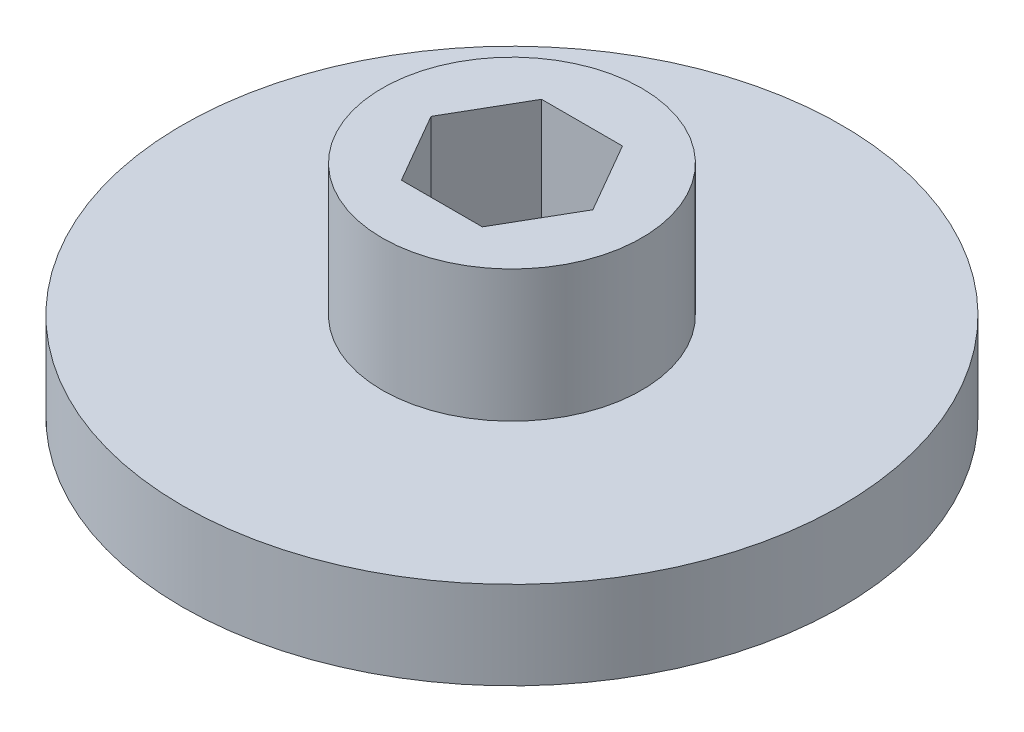
ISO-10303-21;
HEADER;
FILE_DESCRIPTION(('STEP AP214'),'2;1');
FILE_NAME('part.step','',(''),(''),'','','');
FILE_SCHEMA(('AUTOMOTIVE_DESIGN { 1 0 10303 214 1 1 1 1 }'));
ENDSEC;
DATA;
#1=APPLICATION_CONTEXT('core data for automotive mechanical design processes');
#2=APPLICATION_PROTOCOL_DEFINITION('international standard','automotive_design',2000,#1);
#3=PRODUCT_CONTEXT('',#1,'mechanical');
#4=PRODUCT('Part','Part','',(#3));
#5=PRODUCT_RELATED_PRODUCT_CATEGORY('part','',(#4));
#6=PRODUCT_DEFINITION_FORMATION('','',#4);
#7=PRODUCT_DEFINITION_CONTEXT('part definition',#1,'design');
#8=PRODUCT_DEFINITION('design','',#6,#7);
#9=PRODUCT_DEFINITION_SHAPE('','',#8);
#10=(LENGTH_UNIT() NAMED_UNIT(*) SI_UNIT(.MILLI.,.METRE.));
#11=(NAMED_UNIT(*) PLANE_ANGLE_UNIT() SI_UNIT($,.RADIAN.));
#12=(NAMED_UNIT(*) SI_UNIT($,.STERADIAN.) SOLID_ANGLE_UNIT());
#13=UNCERTAINTY_MEASURE_WITH_UNIT(LENGTH_MEASURE(1.E-05),#10,'distance_accuracy_value','');
#14=(GEOMETRIC_REPRESENTATION_CONTEXT(3) GLOBAL_UNCERTAINTY_ASSIGNED_CONTEXT((#13)) GLOBAL_UNIT_ASSIGNED_CONTEXT((#10,
#11,#12)) REPRESENTATION_CONTEXT('',''));
#15=CARTESIAN_POINT('',(0.,0.,0.));
#16=DIRECTION('',(0.,0.,1.));
#17=DIRECTION('',(1.,0.,0.));
#18=AXIS2_PLACEMENT_3D('',#15,#16,#17);
#19=CARTESIAN_POINT('',(0.,5.08,0.));
#20=DIRECTION('',(0.,-1.,0.));
#21=DIRECTION('',(0.,0.,-1.));
#22=AXIS2_PLACEMENT_3D('',#19,#20,#21);
#23=CYLINDRICAL_SURFACE('',#22,19.05);
#24=CARTESIAN_POINT('',(0.,5.08,0.));
#25=DIRECTION('',(0.,1.,0.));
#26=DIRECTION('',(0.,0.,1.));
#27=AXIS2_PLACEMENT_3D('',#24,#25,#26);
#28=CIRCLE('',#27,19.05);
#29=CARTESIAN_POINT('',(0.,5.08,19.05));
#30=VERTEX_POINT('',#29);
#31=EDGE_CURVE('E41',#30,#30,#28,.T.);
#32=ORIENTED_EDGE('',*,*,#31,.F.);
#33=EDGE_LOOP('',(#32));
#34=FACE_BOUND('',#33,.T.);
#35=CARTESIAN_POINT('',(0.,0.,0.));
#36=DIRECTION('',(0.,1.,0.));
#37=DIRECTION('',(0.,0.,1.));
#38=AXIS2_PLACEMENT_3D('',#35,#36,#37);
#39=CIRCLE('',#38,19.05);
#40=CARTESIAN_POINT('',(0.,0.,19.05));
#41=VERTEX_POINT('',#40);
#42=EDGE_CURVE('E36',#41,#41,#39,.T.);
#43=ORIENTED_EDGE('',*,*,#42,.T.);
#44=EDGE_LOOP('',(#43));
#45=FACE_BOUND('',#44,.T.);
#46=ADVANCED_FACE('F33',(#34,#45),#23,.T.);
#47=CARTESIAN_POINT('',(0.,5.08,0.));
#48=DIRECTION('',(0.,1.,0.));
#49=DIRECTION('',(0.,0.,1.));
#50=AXIS2_PLACEMENT_3D('',#47,#48,#49);
#51=PLANE('',#50);
#52=CARTESIAN_POINT('',(0.,5.08,0.));
#53=DIRECTION('',(0.,1.,0.));
#54=DIRECTION('',(0.,0.,1.));
#55=AXIS2_PLACEMENT_3D('',#52,#53,#54);
#56=CIRCLE('',#55,7.5);
#57=CARTESIAN_POINT('',(0.,5.08,-7.5));
#58=VERTEX_POINT('',#57);
#59=EDGE_CURVE('E11',#58,#58,#56,.T.);
#60=ORIENTED_EDGE('',*,*,#59,.F.);
#61=EDGE_LOOP('',(#60));
#62=FACE_BOUND('',#61,.T.);
#63=ORIENTED_EDGE('',*,*,#31,.T.);
#64=EDGE_LOOP('',(#63));
#65=FACE_BOUND('',#64,.T.);
#66=ADVANCED_FACE('F147',(#62,#65),#51,.T.);
#67=CARTESIAN_POINT('',(0.,0.,0.));
#68=DIRECTION('',(0.,1.,0.));
#69=DIRECTION('',(0.,0.,1.));
#70=AXIS2_PLACEMENT_3D('',#67,#68,#69);
#71=PLANE('',#70);
#72=CARTESIAN_POINT('',(0.,0.,0.));
#73=DIRECTION('',(0.,-1.,0.));
#74=DIRECTION('',(0.,0.,-1.));
#75=AXIS2_PLACEMENT_3D('',#72,#73,#74);
#76=CIRCLE('',#75,15.494);
#77=CARTESIAN_POINT('',(0.,0.,-15.494));
#78=VERTEX_POINT('',#77);
#79=EDGE_CURVE('E275',#78,#78,#76,.T.);
#80=ORIENTED_EDGE('',*,*,#79,.F.);
#81=EDGE_LOOP('',(#80));
#82=FACE_BOUND('',#81,.T.);
#83=ORIENTED_EDGE('',*,*,#42,.F.);
#84=EDGE_LOOP('',(#83));
#85=FACE_BOUND('',#84,.T.);
#86=ADVANCED_FACE('F144',(#82,#85),#71,.F.);
#87=CARTESIAN_POINT('',(0.,12.7,0.));
#88=DIRECTION('',(0.,-1.,0.));
#89=DIRECTION('',(0.,0.,-1.));
#90=AXIS2_PLACEMENT_3D('',#87,#88,#89);
#91=CYLINDRICAL_SURFACE('',#90,7.5);
#92=CARTESIAN_POINT('',(0.,12.7,0.));
#93=DIRECTION('',(0.,1.,0.));
#94=DIRECTION('',(0.,0.,1.));
#95=AXIS2_PLACEMENT_3D('',#92,#93,#94);
#96=CIRCLE('',#95,7.5);
#97=CARTESIAN_POINT('',(0.,12.7,-7.5));
#98=VERTEX_POINT('',#97);
#99=EDGE_CURVE('E135',#98,#98,#96,.T.);
#100=CARTESIAN_POINT('',(0.,12.7,-7.5));
#101=CARTESIAN_POINT('',(0.,12.620625,-7.5));
#102=CARTESIAN_POINT('',(0.,12.54125,-7.5));
#103=CARTESIAN_POINT('',(0.,12.3825,-7.5));
#104=CARTESIAN_POINT('',(0.,12.303125,-7.5));
#105=CARTESIAN_POINT('',(0.,12.144375,-7.5));
#106=CARTESIAN_POINT('',(0.,12.065,-7.5));
#107=CARTESIAN_POINT('',(0.,11.90625,-7.5));
#108=CARTESIAN_POINT('',(0.,11.826875,-7.5));
#109=CARTESIAN_POINT('',(0.,11.668125,-7.5));
#110=CARTESIAN_POINT('',(0.,11.58875,-7.5));
#111=CARTESIAN_POINT('',(0.,11.43,-7.5));
#112=CARTESIAN_POINT('',(0.,11.350625,-7.5));
#113=CARTESIAN_POINT('',(0.,11.191875,-7.5));
#114=CARTESIAN_POINT('',(0.,11.1125,-7.5));
#115=CARTESIAN_POINT('',(0.,10.95375,-7.5));
#116=CARTESIAN_POINT('',(0.,10.874375,-7.5));
#117=CARTESIAN_POINT('',(0.,10.715625,-7.5));
#118=CARTESIAN_POINT('',(0.,10.63625,-7.5));
#119=CARTESIAN_POINT('',(0.,10.4775,-7.5));
#120=CARTESIAN_POINT('',(0.,10.398125,-7.5));
#121=CARTESIAN_POINT('',(0.,10.239375,-7.5));
#122=CARTESIAN_POINT('',(0.,10.16,-7.5));
#123=CARTESIAN_POINT('',(0.,10.00125,-7.5));
#124=CARTESIAN_POINT('',(0.,9.921875,-7.5));
#125=CARTESIAN_POINT('',(0.,9.763125,-7.5));
#126=CARTESIAN_POINT('',(0.,9.68375,-7.5));
#127=CARTESIAN_POINT('',(0.,9.525,-7.5));
#128=CARTESIAN_POINT('',(0.,9.445625,-7.5));
#129=CARTESIAN_POINT('',(0.,9.286875,-7.5));
#130=CARTESIAN_POINT('',(0.,9.2075,-7.5));
#131=CARTESIAN_POINT('',(0.,9.04875,-7.5));
#132=CARTESIAN_POINT('',(0.,8.969375,-7.5));
#133=CARTESIAN_POINT('',(0.,8.810625,-7.5));
#134=CARTESIAN_POINT('',(0.,8.73125,-7.5));
#135=CARTESIAN_POINT('',(0.,8.5725,-7.5));
#136=CARTESIAN_POINT('',(0.,8.493125,-7.5));
#137=CARTESIAN_POINT('',(0.,8.334375,-7.5));
#138=CARTESIAN_POINT('',(0.,8.255,-7.5));
#139=CARTESIAN_POINT('',(0.,8.09625,-7.5));
#140=CARTESIAN_POINT('',(0.,8.016875,-7.5));
#141=CARTESIAN_POINT('',(0.,7.858125,-7.5));
#142=CARTESIAN_POINT('',(0.,7.77875,-7.5));
#143=CARTESIAN_POINT('',(0.,7.62,-7.5));
#144=CARTESIAN_POINT('',(0.,7.540625,-7.5));
#145=CARTESIAN_POINT('',(0.,7.381875,-7.5));
#146=CARTESIAN_POINT('',(0.,7.3025,-7.5));
#147=CARTESIAN_POINT('',(0.,7.14375,-7.5));
#148=CARTESIAN_POINT('',(0.,7.064375,-7.5));
#149=CARTESIAN_POINT('',(0.,6.905625,-7.5));
#150=CARTESIAN_POINT('',(0.,6.82625,-7.5));
#151=CARTESIAN_POINT('',(0.,6.6675,-7.5));
#152=CARTESIAN_POINT('',(0.,6.588125,-7.5));
#153=CARTESIAN_POINT('',(0.,6.429375,-7.5));
#154=CARTESIAN_POINT('',(0.,6.35,-7.5));
#155=CARTESIAN_POINT('',(0.,6.19125,-7.5));
#156=CARTESIAN_POINT('',(0.,6.111875,-7.5));
#157=CARTESIAN_POINT('',(0.,5.953125,-7.5));
#158=CARTESIAN_POINT('',(0.,5.87375,-7.5));
#159=CARTESIAN_POINT('',(0.,5.715,-7.5));
#160=CARTESIAN_POINT('',(0.,5.635625,-7.5));
#161=CARTESIAN_POINT('',(0.,5.476875,-7.5));
#162=CARTESIAN_POINT('',(0.,5.3975,-7.5));
#163=CARTESIAN_POINT('',(0.,5.23875,-7.5));
#164=CARTESIAN_POINT('',(0.,5.159375,-7.5));
#165=CARTESIAN_POINT('',(0.,5.08,-7.5));
#166=B_SPLINE_CURVE_WITH_KNOTS('',3,(#100,#101,#102,#103,#104,#105,#106,#107,#108,#109,#110,
#111,#112,#113,#114,#115,#116,#117,#118,#119,#120,#121,#122,#123,#124,#125,#126,#127,#128,#129,
#130,#131,#132,#133,#134,#135,#136,#137,#138,#139,#140,#141,#142,#143,#144,#145,#146,#147,#148,
#149,#150,#151,#152,#153,#154,#155,#156,#157,#158,#159,#160,#161,#162,#163,#164,#165),
.UNSPECIFIED.,.F.,.F.,(4,2,2,2,2,2,2,2,2,2,2,2,2,2,2,2,2,2,2,2,2,2,2,2,2,2,2,2,2,2,2,2,4),(0.,
0.238125,0.476250000000001,0.714375000000001,0.9525,1.190625,1.42875,1.666875,1.905,2.143125,
2.38125,2.619375,2.8575,3.095625,3.33375,3.571875,3.81,4.048125,4.28625,4.524375,4.7625,
5.000625,5.23875,5.476875,5.715,5.953125,6.19125,6.429375,6.6675,6.905625,7.14375,7.381875,
7.62),.UNSPECIFIED.);
#167=EDGE_CURVE('BSEAM146',#98,#58,#166,.T.);
#168=ORIENTED_EDGE('',*,*,#99,.F.);
#169=ORIENTED_EDGE('',*,*,#59,.T.);
#170=ORIENTED_EDGE('',*,*,#167,.T.);
#171=ORIENTED_EDGE('',*,*,#167,.F.);
#172=EDGE_LOOP('',(#168,#170,#169,#171));
#173=FACE_BOUND('',#172,.T.);
#174=ADVANCED_FACE('F146',(#173),#91,.T.);
#175=CARTESIAN_POINT('',(0.,12.7,0.));
#176=DIRECTION('',(0.,1.,0.));
#177=DIRECTION('',(0.,0.,1.));
#178=AXIS2_PLACEMENT_3D('',#175,#176,#177);
#179=PLANE('',#178);
#180=DIRECTION('',(0.5,0.,-0.866025403784439));
#181=VECTOR('',#180,1.);
#182=CARTESIAN_POINT('',(2.33826859021798,12.7,4.05));
#183=LINE('',#182,#181);
#184=CARTESIAN_POINT('',(2.33826859021798,12.7,4.05));
#185=VERTEX_POINT('',#184);
#186=CARTESIAN_POINT('',(4.67653718043597,12.7,0.));
#187=VERTEX_POINT('',#186);
#188=EDGE_CURVE('E49',#185,#187,#183,.T.);
#189=ORIENTED_EDGE('',*,*,#188,.F.);
#190=DIRECTION('',(1.,0.,0.));
#191=VECTOR('',#190,1.);
#192=CARTESIAN_POINT('',(-2.33826859021799,12.7,4.05));
#193=LINE('',#192,#191);
#194=CARTESIAN_POINT('',(-2.33826859021799,12.7,4.05));
#195=VERTEX_POINT('',#194);
#196=EDGE_CURVE('E123',#195,#185,#193,.T.);
#197=ORIENTED_EDGE('',*,*,#196,.F.);
#198=DIRECTION('',(0.5,0.,0.866025403784439));
#199=VECTOR('',#198,1.);
#200=CARTESIAN_POINT('',(-4.67653718043597,12.7,0.));
#201=LINE('',#200,#199);
#202=CARTESIAN_POINT('',(-4.67653718043597,12.7,0.));
#203=VERTEX_POINT('',#202);
#204=EDGE_CURVE('E117',#203,#195,#201,.T.);
#205=ORIENTED_EDGE('',*,*,#204,.F.);
#206=DIRECTION('',(-0.5,0.,0.866025403784439));
#207=VECTOR('',#206,1.);
#208=CARTESIAN_POINT('',(-2.33826859021798,12.7,-4.05));
#209=LINE('',#208,#207);
#210=CARTESIAN_POINT('',(-2.33826859021798,12.7,-4.05));
#211=VERTEX_POINT('',#210);
#212=EDGE_CURVE('E115',#211,#203,#209,.T.);
#213=ORIENTED_EDGE('',*,*,#212,.F.);
#214=DIRECTION('',(-1.,0.,0.));
#215=VECTOR('',#214,1.);
#216=CARTESIAN_POINT('',(2.33826859021798,12.7,-4.05));
#217=LINE('',#216,#215);
#218=CARTESIAN_POINT('',(2.33826859021798,12.7,-4.05));
#219=VERTEX_POINT('',#218);
#220=EDGE_CURVE('E100',#219,#211,#217,.T.);
#221=ORIENTED_EDGE('',*,*,#220,.F.);
#222=DIRECTION('',(-0.5,0.,-0.866025403784439));
#223=VECTOR('',#222,1.);
#224=CARTESIAN_POINT('',(4.67653718043597,12.7,0.));
#225=LINE('',#224,#223);
#226=EDGE_CURVE('E107',#187,#219,#225,.T.);
#227=ORIENTED_EDGE('',*,*,#226,.F.);
#228=EDGE_LOOP('',(#189,#197,#205,#213,#221,#227));
#229=FACE_BOUND('',#228,.T.);
#230=ORIENTED_EDGE('',*,*,#99,.T.);
#231=EDGE_LOOP('',(#230));
#232=FACE_BOUND('',#231,.T.);
#233=ADVANCED_FACE('F111',(#229,#232),#179,.T.);
#234=CARTESIAN_POINT('',(2.33826859021798,-7.29295437638076,4.05));
#235=DIRECTION('',(0.866025403784438,0.,0.5));
#236=DIRECTION('',(0.5,0.,-0.866025403784439));
#237=AXIS2_PLACEMENT_3D('',#234,#235,#236);
#238=PLANE('',#237);
#239=DIRECTION('',(-0.5,0.,0.866025403784439));
#240=VECTOR('',#239,1.);
#241=CARTESIAN_POINT('',(2.33826859021798,5.08,4.05));
#242=LINE('',#241,#240);
#243=CARTESIAN_POINT('',(4.67653718043597,5.08,0.));
#244=VERTEX_POINT('',#243);
#245=CARTESIAN_POINT('',(2.33826859021798,5.08,4.05));
#246=VERTEX_POINT('',#245);
#247=EDGE_CURVE('E68',#244,#246,#242,.T.);
#248=ORIENTED_EDGE('',*,*,#247,.T.);
#249=DIRECTION('',(0.,1.,0.));
#250=VECTOR('',#249,1.);
#251=CARTESIAN_POINT('',(2.33826859021798,-7.29295437638076,4.05));
#252=LINE('',#251,#250);
#253=EDGE_CURVE('E126',#246,#185,#252,.T.);
#254=ORIENTED_EDGE('',*,*,#253,.T.);
#255=ORIENTED_EDGE('',*,*,#188,.T.);
#256=DIRECTION('',(0.,1.,0.));
#257=VECTOR('',#256,1.);
#258=CARTESIAN_POINT('',(4.67653718043597,-7.29295437638076,0.));
#259=LINE('',#258,#257);
#260=EDGE_CURVE('E104',#244,#187,#259,.T.);
#261=ORIENTED_EDGE('',*,*,#260,.F.);
#262=EDGE_LOOP('',(#248,#254,#255,#261));
#263=FACE_BOUND('',#262,.T.);
#264=ADVANCED_FACE('F182',(#263),#238,.F.);
#265=CARTESIAN_POINT('',(-2.33826859021799,-7.29295437638076,4.05));
#266=DIRECTION('',(0.,0.,1.));
#267=DIRECTION('',(1.,0.,0.));
#268=AXIS2_PLACEMENT_3D('',#265,#266,#267);
#269=PLANE('',#268);
#270=DIRECTION('',(-1.,0.,0.));
#271=VECTOR('',#270,1.);
#272=CARTESIAN_POINT('',(-2.33826859021799,5.08,4.05));
#273=LINE('',#272,#271);
#274=CARTESIAN_POINT('',(-2.33826859021799,5.08,4.05));
#275=VERTEX_POINT('',#274);
#276=EDGE_CURVE('E284',#246,#275,#273,.T.);
#277=ORIENTED_EDGE('',*,*,#276,.T.);
#278=DIRECTION('',(0.,1.,0.));
#279=VECTOR('',#278,1.);
#280=CARTESIAN_POINT('',(-2.33826859021799,-7.29295437638076,4.05));
#281=LINE('',#280,#279);
#282=EDGE_CURVE('E128',#275,#195,#281,.T.);
#283=ORIENTED_EDGE('',*,*,#282,.T.);
#284=ORIENTED_EDGE('',*,*,#196,.T.);
#285=ORIENTED_EDGE('',*,*,#253,.F.);
#286=EDGE_LOOP('',(#277,#283,#284,#285));
#287=FACE_BOUND('',#286,.T.);
#288=ADVANCED_FACE('F191',(#287),#269,.F.);
#289=CARTESIAN_POINT('',(-4.67653718043597,-7.29295437638076,0.));
#290=DIRECTION('',(-0.866025403784439,0.,0.5));
#291=DIRECTION('',(0.5,0.,0.866025403784439));
#292=AXIS2_PLACEMENT_3D('',#289,#290,#291);
#293=PLANE('',#292);
#294=DIRECTION('',(-0.5,0.,-0.866025403784439));
#295=VECTOR('',#294,1.);
#296=CARTESIAN_POINT('',(-4.67653718043597,5.08,0.));
#297=LINE('',#296,#295);
#298=CARTESIAN_POINT('',(-4.67653718043597,5.08,0.));
#299=VERTEX_POINT('',#298);
#300=EDGE_CURVE('E282',#275,#299,#297,.T.);
#301=ORIENTED_EDGE('',*,*,#300,.T.);
#302=DIRECTION('',(0.,1.,0.));
#303=VECTOR('',#302,1.);
#304=CARTESIAN_POINT('',(-4.67653718043597,-7.29295437638076,0.));
#305=LINE('',#304,#303);
#306=EDGE_CURVE('E130',#299,#203,#305,.T.);
#307=ORIENTED_EDGE('',*,*,#306,.T.);
#308=ORIENTED_EDGE('',*,*,#204,.T.);
#309=ORIENTED_EDGE('',*,*,#282,.F.);
#310=EDGE_LOOP('',(#301,#307,#308,#309));
#311=FACE_BOUND('',#310,.T.);
#312=ADVANCED_FACE('F200',(#311),#293,.F.);
#313=CARTESIAN_POINT('',(-2.33826859021798,-7.29295437638076,-4.05));
#314=DIRECTION('',(-0.866025403784439,0.,-0.5));
#315=DIRECTION('',(-0.5,0.,0.866025403784439));
#316=AXIS2_PLACEMENT_3D('',#313,#314,#315);
#317=PLANE('',#316);
#318=DIRECTION('',(0.5,0.,-0.866025403784439));
#319=VECTOR('',#318,1.);
#320=CARTESIAN_POINT('',(-2.33826859021798,5.08,-4.05));
#321=LINE('',#320,#319);
#322=CARTESIAN_POINT('',(-2.33826859021798,5.08,-4.05));
#323=VERTEX_POINT('',#322);
#324=EDGE_CURVE('E58',#299,#323,#321,.T.);
#325=ORIENTED_EDGE('',*,*,#324,.T.);
#326=DIRECTION('',(0.,1.,0.));
#327=VECTOR('',#326,1.);
#328=CARTESIAN_POINT('',(-2.33826859021798,-7.29295437638076,-4.05));
#329=LINE('',#328,#327);
#330=EDGE_CURVE('E103',#323,#211,#329,.T.);
#331=ORIENTED_EDGE('',*,*,#330,.T.);
#332=ORIENTED_EDGE('',*,*,#212,.T.);
#333=ORIENTED_EDGE('',*,*,#306,.F.);
#334=EDGE_LOOP('',(#325,#331,#332,#333));
#335=FACE_BOUND('',#334,.T.);
#336=ADVANCED_FACE('F210',(#335),#317,.F.);
#337=CARTESIAN_POINT('',(2.33826859021798,-7.29295437638076,-4.05));
#338=DIRECTION('',(0.,0.,-1.));
#339=DIRECTION('',(-1.,0.,0.));
#340=AXIS2_PLACEMENT_3D('',#337,#338,#339);
#341=PLANE('',#340);
#342=DIRECTION('',(1.,0.,0.));
#343=VECTOR('',#342,1.);
#344=CARTESIAN_POINT('',(2.33826859021798,5.08,-4.05));
#345=LINE('',#344,#343);
#346=CARTESIAN_POINT('',(2.33826859021798,5.08,-4.05));
#347=VERTEX_POINT('',#346);
#348=EDGE_CURVE('E102',#323,#347,#345,.T.);
#349=ORIENTED_EDGE('',*,*,#348,.T.);
#350=DIRECTION('',(0.,1.,0.));
#351=VECTOR('',#350,1.);
#352=CARTESIAN_POINT('',(2.33826859021798,-7.29295437638076,-4.05));
#353=LINE('',#352,#351);
#354=EDGE_CURVE('E95',#347,#219,#353,.T.);
#355=ORIENTED_EDGE('',*,*,#354,.T.);
#356=ORIENTED_EDGE('',*,*,#220,.T.);
#357=ORIENTED_EDGE('',*,*,#330,.F.);
#358=EDGE_LOOP('',(#349,#355,#356,#357));
#359=FACE_BOUND('',#358,.T.);
#360=ADVANCED_FACE('F97',(#359),#341,.F.);
#361=CARTESIAN_POINT('',(4.67653718043597,-7.29295437638076,0.));
#362=DIRECTION('',(0.866025403784439,0.,-0.5));
#363=DIRECTION('',(-0.5,0.,-0.866025403784439));
#364=AXIS2_PLACEMENT_3D('',#361,#362,#363);
#365=PLANE('',#364);
#366=DIRECTION('',(0.5,0.,0.866025403784439));
#367=VECTOR('',#366,1.);
#368=CARTESIAN_POINT('',(4.67653718043597,5.08,0.));
#369=LINE('',#368,#367);
#370=EDGE_CURVE('E77',#347,#244,#369,.T.);
#371=ORIENTED_EDGE('',*,*,#370,.T.);
#372=ORIENTED_EDGE('',*,*,#260,.T.);
#373=ORIENTED_EDGE('',*,*,#226,.T.);
#374=ORIENTED_EDGE('',*,*,#354,.F.);
#375=EDGE_LOOP('',(#371,#372,#373,#374));
#376=FACE_BOUND('',#375,.T.);
#377=ADVANCED_FACE('F108',(#376),#365,.F.);
#378=CARTESIAN_POINT('',(0.,5.08,0.));
#379=DIRECTION('',(0.,1.,0.));
#380=DIRECTION('',(0.,0.,1.));
#381=AXIS2_PLACEMENT_3D('',#378,#379,#380);
#382=PLANE('',#381);
#383=ORIENTED_EDGE('',*,*,#247,.F.);
#384=ORIENTED_EDGE('',*,*,#370,.F.);
#385=ORIENTED_EDGE('',*,*,#348,.F.);
#386=ORIENTED_EDGE('',*,*,#324,.F.);
#387=ORIENTED_EDGE('',*,*,#300,.F.);
#388=ORIENTED_EDGE('',*,*,#276,.F.);
#389=EDGE_LOOP('',(#383,#384,#385,#386,#387,#388));
#390=FACE_BOUND('',#389,.T.);
#391=ADVANCED_FACE('F236',(#390),#382,.T.);
#392=CARTESIAN_POINT('',(0.,3.81,0.));
#393=DIRECTION('',(0.,-1.,0.));
#394=DIRECTION('',(0.,0.,-1.));
#395=AXIS2_PLACEMENT_3D('',#392,#393,#394);
#396=CYLINDRICAL_SURFACE('',#395,15.494);
#397=CARTESIAN_POINT('',(0.,3.81,0.));
#398=DIRECTION('',(0.,-1.,0.));
#399=DIRECTION('',(0.,0.,-1.));
#400=AXIS2_PLACEMENT_3D('',#397,#398,#399);
#401=CIRCLE('',#400,15.494);
#402=CARTESIAN_POINT('',(0.,3.81,-15.494));
#403=VERTEX_POINT('',#402);
#404=EDGE_CURVE('E274',#403,#403,#401,.T.);
#405=CARTESIAN_POINT('',(0.,3.81,-15.494));
#406=CARTESIAN_POINT('',(0.,3.7703125,-15.494));
#407=CARTESIAN_POINT('',(0.,3.730625,-15.494));
#408=CARTESIAN_POINT('',(0.,3.65125,-15.494));
#409=CARTESIAN_POINT('',(0.,3.6115625,-15.494));
#410=CARTESIAN_POINT('',(0.,3.5321875,-15.494));
#411=CARTESIAN_POINT('',(0.,3.4925,-15.494));
#412=CARTESIAN_POINT('',(0.,3.413125,-15.494));
#413=CARTESIAN_POINT('',(0.,3.3734375,-15.494));
#414=CARTESIAN_POINT('',(0.,3.2940625,-15.494));
#415=CARTESIAN_POINT('',(0.,3.254375,-15.494));
#416=CARTESIAN_POINT('',(0.,3.175,-15.494));
#417=CARTESIAN_POINT('',(0.,3.1353125,-15.494));
#418=CARTESIAN_POINT('',(0.,3.0559375,-15.494));
#419=CARTESIAN_POINT('',(0.,3.01625,-15.494));
#420=CARTESIAN_POINT('',(0.,2.936875,-15.494));
#421=CARTESIAN_POINT('',(0.,2.8971875,-15.494));
#422=CARTESIAN_POINT('',(0.,2.8178125,-15.494));
#423=CARTESIAN_POINT('',(0.,2.778125,-15.494));
#424=CARTESIAN_POINT('',(0.,2.69875,-15.494));
#425=CARTESIAN_POINT('',(0.,2.6590625,-15.494));
#426=CARTESIAN_POINT('',(0.,2.5796875,-15.494));
#427=CARTESIAN_POINT('',(0.,2.54,-15.494));
#428=CARTESIAN_POINT('',(0.,2.460625,-15.494));
#429=CARTESIAN_POINT('',(0.,2.4209375,-15.494));
#430=CARTESIAN_POINT('',(0.,2.3415625,-15.494));
#431=CARTESIAN_POINT('',(0.,2.301875,-15.494));
#432=CARTESIAN_POINT('',(0.,2.2225,-15.494));
#433=CARTESIAN_POINT('',(0.,2.1828125,-15.494));
#434=CARTESIAN_POINT('',(0.,2.1034375,-15.494));
#435=CARTESIAN_POINT('',(0.,2.06375,-15.494));
#436=CARTESIAN_POINT('',(0.,1.984375,-15.494));
#437=CARTESIAN_POINT('',(0.,1.9446875,-15.494));
#438=CARTESIAN_POINT('',(0.,1.8653125,-15.494));
#439=CARTESIAN_POINT('',(0.,1.825625,-15.494));
#440=CARTESIAN_POINT('',(0.,1.74625,-15.494));
#441=CARTESIAN_POINT('',(0.,1.7065625,-15.494));
#442=CARTESIAN_POINT('',(0.,1.6271875,-15.494));
#443=CARTESIAN_POINT('',(0.,1.5875,-15.494));
#444=CARTESIAN_POINT('',(0.,1.508125,-15.494));
#445=CARTESIAN_POINT('',(0.,1.4684375,-15.494));
#446=CARTESIAN_POINT('',(0.,1.3890625,-15.494));
#447=CARTESIAN_POINT('',(0.,1.349375,-15.494));
#448=CARTESIAN_POINT('',(0.,1.27,-15.494));
#449=CARTESIAN_POINT('',(0.,1.2303125,-15.494));
#450=CARTESIAN_POINT('',(0.,1.1509375,-15.494));
#451=CARTESIAN_POINT('',(0.,1.11125,-15.494));
#452=CARTESIAN_POINT('',(0.,1.031875,-15.494));
#453=CARTESIAN_POINT('',(0.,0.9921875,-15.494));
#454=CARTESIAN_POINT('',(0.,0.9128125,-15.494));
#455=CARTESIAN_POINT('',(0.,0.873125,-15.494));
#456=CARTESIAN_POINT('',(0.,0.79375,-15.494));
#457=CARTESIAN_POINT('',(0.,0.7540625,-15.494));
#458=CARTESIAN_POINT('',(0.,0.6746875,-15.494));
#459=CARTESIAN_POINT('',(0.,0.635,-15.494));
#460=CARTESIAN_POINT('',(0.,0.555625,-15.494));
#461=CARTESIAN_POINT('',(0.,0.5159375,-15.494));
#462=CARTESIAN_POINT('',(0.,0.4365625,-15.494));
#463=CARTESIAN_POINT('',(0.,0.396875,-15.494));
#464=CARTESIAN_POINT('',(0.,0.3175,-15.494));
#465=CARTESIAN_POINT('',(0.,0.2778125,-15.494));
#466=CARTESIAN_POINT('',(0.,0.1984375,-15.494));
#467=CARTESIAN_POINT('',(0.,0.15875,-15.494));
#468=CARTESIAN_POINT('',(0.,0.0793749999999999,-15.494));
#469=CARTESIAN_POINT('',(0.,0.0396874999999999,-15.494));
#470=CARTESIAN_POINT('',(0.,0.,-15.494));
#471=B_SPLINE_CURVE_WITH_KNOTS('',3,(#405,#406,#407,#408,#409,#410,#411,#412,#413,#414,#415,
#416,#417,#418,#419,#420,#421,#422,#423,#424,#425,#426,#427,#428,#429,#430,#431,#432,#433,#434,
#435,#436,#437,#438,#439,#440,#441,#442,#443,#444,#445,#446,#447,#448,#449,#450,#451,#452,#453,
#454,#455,#456,#457,#458,#459,#460,#461,#462,#463,#464,#465,#466,#467,#468,#469,#470),
.UNSPECIFIED.,.F.,.F.,(4,2,2,2,2,2,2,2,2,2,2,2,2,2,2,2,2,2,2,2,2,2,2,2,2,2,2,2,2,2,2,2,4),(0.,
0.1190625,0.238125,0.3571875,0.47625,0.5953125,0.714375,0.8334375,0.9525,1.0715625,1.190625,
1.3096875,1.42875,1.5478125,1.666875,1.7859375,1.905,2.0240625,2.143125,2.2621875,2.38125,
2.5003125,2.619375,2.7384375,2.8575,2.9765625,3.095625,3.2146875,3.33375,3.4528125,3.571875,
3.6909375,3.81),.UNSPECIFIED.);
#472=EDGE_CURVE('BSEAM244',#403,#78,#471,.T.);
#473=ORIENTED_EDGE('',*,*,#404,.F.);
#474=ORIENTED_EDGE('',*,*,#79,.T.);
#475=ORIENTED_EDGE('',*,*,#472,.T.);
#476=ORIENTED_EDGE('',*,*,#472,.F.);
#477=EDGE_LOOP('',(#473,#475,#474,#476));
#478=FACE_BOUND('',#477,.T.);
#479=ADVANCED_FACE('F244',(#478),#396,.F.);
#480=CARTESIAN_POINT('',(0.,3.81,0.));
#481=DIRECTION('',(0.,-1.,0.));
#482=DIRECTION('',(0.,0.,-1.));
#483=AXIS2_PLACEMENT_3D('',#480,#481,#482);
#484=PLANE('',#483);
#485=ORIENTED_EDGE('',*,*,#404,.T.);
#486=EDGE_LOOP('',(#485));
#487=FACE_BOUND('',#486,.T.);
#488=ADVANCED_FACE('F258',(#487),#484,.T.);
#489=CLOSED_SHELL('',(#46,#66,#86,#174,#233,#264,#288,#312,#336,#360,#377,#391,#479,#488));
#490=MANIFOLD_SOLID_BREP('B2',#489);
#491=ADVANCED_BREP_SHAPE_REPRESENTATION('',(#18,#490),#14);
#492=SHAPE_DEFINITION_REPRESENTATION(#9,#491);
ENDSEC;
END-ISO-10303-21;
